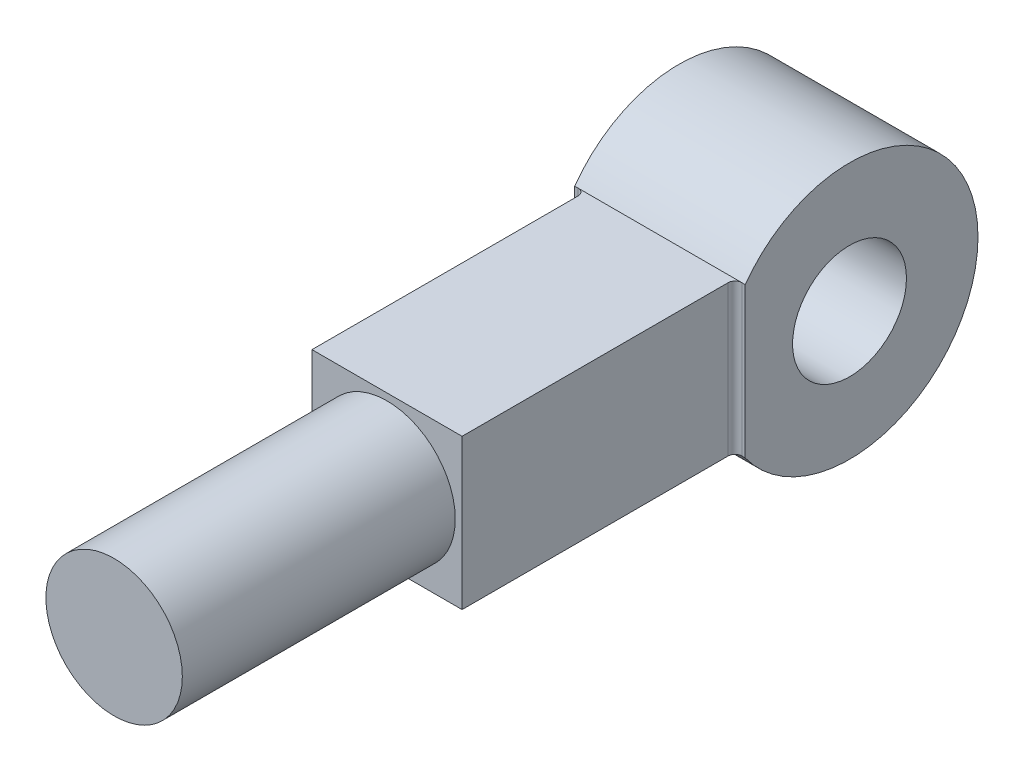
ISO-10303-21;
HEADER;
FILE_DESCRIPTION(('STEP AP214'),'2;1');
FILE_NAME('part.step','',(''),(''),'','','');
FILE_SCHEMA(('AUTOMOTIVE_DESIGN { 1 0 10303 214 1 1 1 1 }'));
ENDSEC;
DATA;
#1=APPLICATION_CONTEXT('core data for automotive mechanical design processes');
#2=APPLICATION_PROTOCOL_DEFINITION('international standard','automotive_design',2000,#1);
#3=PRODUCT_CONTEXT('',#1,'mechanical');
#4=PRODUCT('Part','Part','',(#3));
#5=PRODUCT_RELATED_PRODUCT_CATEGORY('part','',(#4));
#6=PRODUCT_DEFINITION_FORMATION('','',#4);
#7=PRODUCT_DEFINITION_CONTEXT('part definition',#1,'design');
#8=PRODUCT_DEFINITION('design','',#6,#7);
#9=PRODUCT_DEFINITION_SHAPE('','',#8);
#10=(LENGTH_UNIT() NAMED_UNIT(*) SI_UNIT(.MILLI.,.METRE.));
#11=(NAMED_UNIT(*) PLANE_ANGLE_UNIT() SI_UNIT($,.RADIAN.));
#12=(NAMED_UNIT(*) SI_UNIT($,.STERADIAN.) SOLID_ANGLE_UNIT());
#13=UNCERTAINTY_MEASURE_WITH_UNIT(LENGTH_MEASURE(1.E-05),#10,'distance_accuracy_value','');
#14=(GEOMETRIC_REPRESENTATION_CONTEXT(3) GLOBAL_UNCERTAINTY_ASSIGNED_CONTEXT((#13)) GLOBAL_UNIT_ASSIGNED_CONTEXT((#10,
#11,#12)) REPRESENTATION_CONTEXT('',''));
#15=CARTESIAN_POINT('',(0.,0.,0.));
#16=DIRECTION('',(0.,0.,1.));
#17=DIRECTION('',(1.,0.,0.));
#18=AXIS2_PLACEMENT_3D('',#15,#16,#17);
#19=CARTESIAN_POINT('',(25.,0.,0.));
#20=DIRECTION('',(1.,0.,0.));
#21=DIRECTION('',(0.,0.,-1.));
#22=AXIS2_PLACEMENT_3D('',#19,#20,#21);
#23=PLANE('',#22);
#24=DIRECTION('',(0.,-1.,0.));
#25=VECTOR('',#24,1.);
#26=CARTESIAN_POINT('',(25.,18.83,15.2829611005197));
#27=LINE('',#26,#25);
#28=CARTESIAN_POINT('',(25.,11.,15.2829611005197));
#29=VERTEX_POINT('',#28);
#30=CARTESIAN_POINT('',(25.,-11.,15.2829611005198));
#31=VERTEX_POINT('',#30);
#32=EDGE_CURVE('E179',#29,#31,#27,.T.);
#33=ORIENTED_EDGE('',*,*,#32,.T.);
#34=CARTESIAN_POINT('',(25.,0.,0.));
#35=DIRECTION('',(1.,0.,0.));
#36=DIRECTION('',(0.,0.,-1.));
#37=AXIS2_PLACEMENT_3D('',#34,#35,#36);
#38=CIRCLE('',#37,18.83);
#39=EDGE_CURVE('E148',#31,#29,#38,.T.);
#40=ORIENTED_EDGE('',*,*,#39,.T.);
#41=EDGE_LOOP('',(#33,#40));
#42=FACE_BOUND('',#41,.T.);
#43=CARTESIAN_POINT('',(25.,0.,0.));
#44=DIRECTION('',(1.,0.,0.));
#45=DIRECTION('',(0.,0.,-1.));
#46=AXIS2_PLACEMENT_3D('',#43,#44,#45);
#47=CIRCLE('',#46,8.345);
#48=CARTESIAN_POINT('',(25.,0.,-8.345));
#49=VERTEX_POINT('',#48);
#50=EDGE_CURVE('E205',#49,#49,#47,.T.);
#51=ORIENTED_EDGE('',*,*,#50,.F.);
#52=EDGE_LOOP('',(#51));
#53=FACE_BOUND('',#52,.T.);
#54=ADVANCED_FACE('F45',(#42,#53),#23,.T.);
#55=CARTESIAN_POINT('',(0.,0.,0.));
#56=DIRECTION('',(1.,0.,0.));
#57=DIRECTION('',(0.,0.,-1.));
#58=AXIS2_PLACEMENT_3D('',#55,#56,#57);
#59=PLANE('',#58);
#60=CARTESIAN_POINT('',(0.,0.,0.));
#61=DIRECTION('',(1.,0.,0.));
#62=DIRECTION('',(0.,0.,-1.));
#63=AXIS2_PLACEMENT_3D('',#60,#61,#62);
#64=CIRCLE('',#63,18.83);
#65=CARTESIAN_POINT('',(0.,-11.,15.2829611005198));
#66=VERTEX_POINT('',#65);
#67=CARTESIAN_POINT('',(0.,11.,15.2829611005197));
#68=VERTEX_POINT('',#67);
#69=EDGE_CURVE('E154',#66,#68,#64,.T.);
#70=ORIENTED_EDGE('',*,*,#69,.F.);
#71=DIRECTION('',(0.,-1.,0.));
#72=VECTOR('',#71,1.);
#73=CARTESIAN_POINT('',(0.,18.83,15.2829611005197));
#74=LINE('',#73,#72);
#75=EDGE_CURVE('E70',#68,#66,#74,.T.);
#76=ORIENTED_EDGE('',*,*,#75,.F.);
#77=EDGE_LOOP('',(#70,#76));
#78=FACE_BOUND('',#77,.T.);
#79=CARTESIAN_POINT('',(0.,0.,0.));
#80=DIRECTION('',(1.,0.,0.));
#81=DIRECTION('',(0.,0.,-1.));
#82=AXIS2_PLACEMENT_3D('',#79,#80,#81);
#83=CIRCLE('',#82,8.345);
#84=CARTESIAN_POINT('',(0.,0.,-8.345));
#85=VERTEX_POINT('',#84);
#86=EDGE_CURVE('E204',#85,#85,#83,.T.);
#87=ORIENTED_EDGE('',*,*,#86,.T.);
#88=EDGE_LOOP('',(#87));
#89=FACE_BOUND('',#88,.T.);
#90=ADVANCED_FACE('F213',(#78,#89),#59,.F.);
#91=CARTESIAN_POINT('',(25.,0.,0.));
#92=DIRECTION('',(-1.,0.,0.));
#93=DIRECTION('',(0.,0.,1.));
#94=AXIS2_PLACEMENT_3D('',#91,#92,#93);
#95=CYLINDRICAL_SURFACE('',#94,18.83);
#96=ORIENTED_EDGE('',*,*,#69,.T.);
#97=DIRECTION('',(1.,0.,0.));
#98=VECTOR('',#97,1.);
#99=CARTESIAN_POINT('',(25.,11.,15.2829611005197));
#100=LINE('',#99,#98);
#101=CARTESIAN_POINT('',(0.5,11.,15.2829611005197));
#102=VERTEX_POINT('',#101);
#103=EDGE_CURVE('E192',#68,#102,#100,.T.);
#104=ORIENTED_EDGE('',*,*,#103,.T.);
#105=DIRECTION('',(-1.,0.,0.));
#106=VECTOR('',#105,1.);
#107=CARTESIAN_POINT('',(25.,11.,15.2829611005198));
#108=LINE('',#107,#106);
#109=CARTESIAN_POINT('',(24.5,11.,15.2829611005197));
#110=VERTEX_POINT('',#109);
#111=EDGE_CURVE('E162',#110,#102,#108,.T.);
#112=ORIENTED_EDGE('',*,*,#111,.F.);
#113=EDGE_CURVE('E49',#29,#110,#108,.T.);
#114=ORIENTED_EDGE('',*,*,#113,.F.);
#115=ORIENTED_EDGE('',*,*,#39,.F.);
#116=DIRECTION('',(-1.,0.,0.));
#117=VECTOR('',#116,1.);
#118=CARTESIAN_POINT('',(25.,-11.,15.2829611005198));
#119=LINE('',#118,#117);
#120=CARTESIAN_POINT('',(24.5,-11.,15.2829611005198));
#121=VERTEX_POINT('',#120);
#122=EDGE_CURVE('E146',#31,#121,#119,.T.);
#123=ORIENTED_EDGE('',*,*,#122,.T.);
#124=CARTESIAN_POINT('',(0.5,-11.,15.2829611005198));
#125=VERTEX_POINT('',#124);
#126=EDGE_CURVE('E140',#121,#125,#119,.T.);
#127=ORIENTED_EDGE('',*,*,#126,.T.);
#128=DIRECTION('',(1.,0.,0.));
#129=VECTOR('',#128,1.);
#130=CARTESIAN_POINT('',(0.,-11.,15.2829611005198));
#131=LINE('',#130,#129);
#132=EDGE_CURVE('E126',#66,#125,#131,.T.);
#133=ORIENTED_EDGE('',*,*,#132,.F.);
#134=EDGE_LOOP('',(#96,#104,#112,#114,#115,#123,#127,#133));
#135=FACE_BOUND('',#134,.T.);
#136=ADVANCED_FACE('F47',(#135),#95,.T.);
#137=CARTESIAN_POINT('',(25.,11.,15.2829611005198));
#138=DIRECTION('',(0.,-1.,0.));
#139=DIRECTION('',(0.,0.,-1.));
#140=AXIS2_PLACEMENT_3D('',#137,#138,#139);
#141=PLANE('',#140);
#142=CARTESIAN_POINT('',(0.5,11.,16.2829611005197));
#143=DIRECTION('',(0.,-1.,0.));
#144=DIRECTION('',(0.,0.,-1.));
#145=AXIS2_PLACEMENT_3D('',#142,#143,#144);
#146=CIRCLE('',#145,0.999999999999999);
#147=CARTESIAN_POINT('',(1.5,11.,16.2829611005197));
#148=VERTEX_POINT('',#147);
#149=EDGE_CURVE('E121',#102,#148,#146,.T.);
#150=ORIENTED_EDGE('',*,*,#149,.T.);
#151=DIRECTION('',(0.,0.,1.));
#152=VECTOR('',#151,1.);
#153=CARTESIAN_POINT('',(1.5,11.,15.2829611005198));
#154=LINE('',#153,#152);
#155=CARTESIAN_POINT('',(1.5,11.,55.2829611005197));
#156=VERTEX_POINT('',#155);
#157=EDGE_CURVE('E197',#148,#156,#154,.T.);
#158=ORIENTED_EDGE('',*,*,#157,.T.);
#159=DIRECTION('',(-1.,0.,0.));
#160=VECTOR('',#159,1.);
#161=CARTESIAN_POINT('',(25.,11.,55.2829611005197));
#162=LINE('',#161,#160);
#163=CARTESIAN_POINT('',(23.5,11.,55.2829611005197));
#164=VERTEX_POINT('',#163);
#165=EDGE_CURVE('E159',#164,#156,#162,.T.);
#166=ORIENTED_EDGE('',*,*,#165,.F.);
#167=DIRECTION('',(0.,0.,-1.));
#168=VECTOR('',#167,1.);
#169=CARTESIAN_POINT('',(23.5,11.,15.2829611005198));
#170=LINE('',#169,#168);
#171=CARTESIAN_POINT('',(23.5,11.,16.2829611005197));
#172=VERTEX_POINT('',#171);
#173=EDGE_CURVE('E190',#164,#172,#170,.T.);
#174=ORIENTED_EDGE('',*,*,#173,.T.);
#175=CARTESIAN_POINT('',(24.5,11.,16.2829611005197));
#176=DIRECTION('',(0.,-1.,0.));
#177=DIRECTION('',(0.,0.,-1.));
#178=AXIS2_PLACEMENT_3D('',#175,#176,#177);
#179=CIRCLE('',#178,1.);
#180=EDGE_CURVE('E182',#172,#110,#179,.T.);
#181=ORIENTED_EDGE('',*,*,#180,.T.);
#182=ORIENTED_EDGE('',*,*,#111,.T.);
#183=EDGE_LOOP('',(#150,#158,#166,#174,#181,#182));
#184=FACE_BOUND('',#183,.T.);
#185=ADVANCED_FACE('F189',(#184),#141,.F.);
#186=CARTESIAN_POINT('',(25.,-11.,55.2829611005197));
#187=DIRECTION('',(0.,0.,-1.));
#188=DIRECTION('',(-1.,0.,0.));
#189=AXIS2_PLACEMENT_3D('',#186,#187,#188);
#190=PLANE('',#189);
#191=CARTESIAN_POINT('',(12.5,-1.21430643318376E-13,55.2829611005197));
#192=DIRECTION('',(0.,0.,1.));
#193=DIRECTION('',(1.,0.,0.));
#194=AXIS2_PLACEMENT_3D('',#191,#192,#193);
#195=CIRCLE('',#194,10.);
#196=CARTESIAN_POINT('',(22.5,-1.21430643318376E-13,55.2829611005197));
#197=VERTEX_POINT('',#196);
#198=EDGE_CURVE('E11',#197,#197,#195,.T.);
#199=ORIENTED_EDGE('',*,*,#198,.F.);
#200=EDGE_LOOP('',(#199));
#201=FACE_BOUND('',#200,.T.);
#202=ORIENTED_EDGE('',*,*,#165,.T.);
#203=DIRECTION('',(0.,-1.,0.));
#204=VECTOR('',#203,1.);
#205=CARTESIAN_POINT('',(1.5,18.83,55.2829611005197));
#206=LINE('',#205,#204);
#207=CARTESIAN_POINT('',(1.5,-11.,55.2829611005197));
#208=VERTEX_POINT('',#207);
#209=EDGE_CURVE('E366',#156,#208,#206,.T.);
#210=ORIENTED_EDGE('',*,*,#209,.T.);
#211=DIRECTION('',(-1.,0.,0.));
#212=VECTOR('',#211,1.);
#213=CARTESIAN_POINT('',(25.,-11.,55.2829611005197));
#214=LINE('',#213,#212);
#215=CARTESIAN_POINT('',(23.5,-11.,55.2829611005197));
#216=VERTEX_POINT('',#215);
#217=EDGE_CURVE('E152',#216,#208,#214,.T.);
#218=ORIENTED_EDGE('',*,*,#217,.F.);
#219=DIRECTION('',(0.,-1.,0.));
#220=VECTOR('',#219,1.);
#221=CARTESIAN_POINT('',(23.5,18.83,55.2829611005197));
#222=LINE('',#221,#220);
#223=EDGE_CURVE('E62',#164,#216,#222,.T.);
#224=ORIENTED_EDGE('',*,*,#223,.F.);
#225=EDGE_LOOP('',(#202,#210,#218,#224));
#226=FACE_BOUND('',#225,.T.);
#227=ADVANCED_FACE('F224',(#201,#226),#190,.F.);
#228=CARTESIAN_POINT('',(25.,-11.,15.2829611005198));
#229=DIRECTION('',(0.,1.,0.));
#230=DIRECTION('',(0.,0.,1.));
#231=AXIS2_PLACEMENT_3D('',#228,#229,#230);
#232=PLANE('',#231);
#233=ORIENTED_EDGE('',*,*,#217,.T.);
#234=DIRECTION('',(0.,0.,1.));
#235=VECTOR('',#234,1.);
#236=CARTESIAN_POINT('',(1.5,-11.,16.2829611005197));
#237=LINE('',#236,#235);
#238=CARTESIAN_POINT('',(1.5,-11.,16.2829611005197));
#239=VERTEX_POINT('',#238);
#240=EDGE_CURVE('E142',#239,#208,#237,.T.);
#241=ORIENTED_EDGE('',*,*,#240,.F.);
#242=CARTESIAN_POINT('',(0.5,-11.,16.2829611005197));
#243=DIRECTION('',(0.,-1.,0.));
#244=DIRECTION('',(0.,0.,1.));
#245=AXIS2_PLACEMENT_3D('',#242,#243,#244);
#246=CIRCLE('',#245,0.999999999999999);
#247=EDGE_CURVE('E118',#125,#239,#246,.T.);
#248=ORIENTED_EDGE('',*,*,#247,.F.);
#249=ORIENTED_EDGE('',*,*,#126,.F.);
#250=CARTESIAN_POINT('',(24.5,-11.,16.2829611005198));
#251=DIRECTION('',(0.,-1.,0.));
#252=DIRECTION('',(0.,0.,-1.));
#253=AXIS2_PLACEMENT_3D('',#250,#251,#252);
#254=CIRCLE('',#253,1.);
#255=CARTESIAN_POINT('',(23.5,-11.,16.2829611005198));
#256=VERTEX_POINT('',#255);
#257=EDGE_CURVE('E184',#256,#121,#254,.T.);
#258=ORIENTED_EDGE('',*,*,#257,.F.);
#259=DIRECTION('',(0.,0.,-1.));
#260=VECTOR('',#259,1.);
#261=CARTESIAN_POINT('',(23.5,-11.,55.2829611005197));
#262=LINE('',#261,#260);
#263=EDGE_CURVE('E133',#216,#256,#262,.T.);
#264=ORIENTED_EDGE('',*,*,#263,.F.);
#265=EDGE_LOOP('',(#233,#241,#248,#249,#258,#264));
#266=FACE_BOUND('',#265,.T.);
#267=ADVANCED_FACE('F138',(#266),#232,.F.);
#268=CARTESIAN_POINT('',(25.,0.,0.));
#269=DIRECTION('',(-1.,0.,0.));
#270=DIRECTION('',(0.,0.,1.));
#271=AXIS2_PLACEMENT_3D('',#268,#269,#270);
#272=CYLINDRICAL_SURFACE('',#271,8.345);
#273=ORIENTED_EDGE('',*,*,#50,.T.);
#274=EDGE_LOOP('',(#273));
#275=FACE_BOUND('',#274,.T.);
#276=ORIENTED_EDGE('',*,*,#86,.F.);
#277=EDGE_LOOP('',(#276));
#278=FACE_BOUND('',#277,.T.);
#279=ADVANCED_FACE('F215',(#275,#278),#272,.F.);
#280=CARTESIAN_POINT('',(24.5,18.83,15.2829611005197));
#281=DIRECTION('',(0.,0.,-1.));
#282=DIRECTION('',(0.,1.,0.));
#283=AXIS2_PLACEMENT_3D('',#280,#281,#282);
#284=PLANE('',#283);
#285=DIRECTION('',(0.,-1.,0.));
#286=VECTOR('',#285,1.);
#287=CARTESIAN_POINT('',(24.5,18.83,15.2829611005197));
#288=LINE('',#287,#286);
#289=EDGE_CURVE('E176',#110,#121,#288,.T.);
#290=ORIENTED_EDGE('',*,*,#289,.T.);
#291=ORIENTED_EDGE('',*,*,#122,.F.);
#292=ORIENTED_EDGE('',*,*,#32,.F.);
#293=ORIENTED_EDGE('',*,*,#113,.T.);
#294=EDGE_LOOP('',(#290,#291,#292,#293));
#295=FACE_BOUND('',#294,.T.);
#296=ADVANCED_FACE('F175',(#295),#284,.F.);
#297=CARTESIAN_POINT('',(24.5,18.83,16.2829611005197));
#298=DIRECTION('',(0.,-1.,0.));
#299=DIRECTION('',(0.,0.,-1.));
#300=AXIS2_PLACEMENT_3D('',#297,#298,#299);
#301=CYLINDRICAL_SURFACE('',#300,1.);
#302=DIRECTION('',(0.,-1.,0.));
#303=VECTOR('',#302,1.);
#304=CARTESIAN_POINT('',(23.5,18.83,16.2829611005197));
#305=LINE('',#304,#303);
#306=EDGE_CURVE('E186',#172,#256,#305,.T.);
#307=ORIENTED_EDGE('',*,*,#306,.T.);
#308=ORIENTED_EDGE('',*,*,#257,.T.);
#309=ORIENTED_EDGE('',*,*,#289,.F.);
#310=ORIENTED_EDGE('',*,*,#180,.F.);
#311=EDGE_LOOP('',(#307,#308,#309,#310));
#312=FACE_BOUND('',#311,.T.);
#313=ADVANCED_FACE('F181',(#312),#301,.F.);
#314=CARTESIAN_POINT('',(23.5,18.83,55.2829611005197));
#315=DIRECTION('',(-1.,0.,0.));
#316=DIRECTION('',(0.,0.,1.));
#317=AXIS2_PLACEMENT_3D('',#314,#315,#316);
#318=PLANE('',#317);
#319=ORIENTED_EDGE('',*,*,#223,.T.);
#320=ORIENTED_EDGE('',*,*,#263,.T.);
#321=ORIENTED_EDGE('',*,*,#306,.F.);
#322=ORIENTED_EDGE('',*,*,#173,.F.);
#323=EDGE_LOOP('',(#319,#320,#321,#322));
#324=FACE_BOUND('',#323,.T.);
#325=ADVANCED_FACE('F284',(#324),#318,.F.);
#326=CARTESIAN_POINT('',(1.5,18.83,16.2829611005197));
#327=DIRECTION('',(1.,0.,0.));
#328=DIRECTION('',(0.,0.,-1.));
#329=AXIS2_PLACEMENT_3D('',#326,#327,#328);
#330=PLANE('',#329);
#331=DIRECTION('',(0.,-1.,0.));
#332=VECTOR('',#331,1.);
#333=CARTESIAN_POINT('',(1.5,18.83,16.2829611005197));
#334=LINE('',#333,#332);
#335=EDGE_CURVE('E124',#148,#239,#334,.T.);
#336=ORIENTED_EDGE('',*,*,#335,.T.);
#337=ORIENTED_EDGE('',*,*,#240,.T.);
#338=ORIENTED_EDGE('',*,*,#209,.F.);
#339=ORIENTED_EDGE('',*,*,#157,.F.);
#340=EDGE_LOOP('',(#336,#337,#338,#339));
#341=FACE_BOUND('',#340,.T.);
#342=ADVANCED_FACE('F294',(#341),#330,.F.);
#343=CARTESIAN_POINT('',(0.5,18.83,16.2829611005197));
#344=DIRECTION('',(0.,-1.,0.));
#345=DIRECTION('',(0.,0.,-1.));
#346=AXIS2_PLACEMENT_3D('',#343,#344,#345);
#347=CYLINDRICAL_SURFACE('',#346,0.999999999999999);
#348=DIRECTION('',(0.,-1.,0.));
#349=VECTOR('',#348,1.);
#350=CARTESIAN_POINT('',(0.5,18.83,15.2829611005197));
#351=LINE('',#350,#349);
#352=EDGE_CURVE('E114',#102,#125,#351,.T.);
#353=ORIENTED_EDGE('',*,*,#352,.T.);
#354=ORIENTED_EDGE('',*,*,#247,.T.);
#355=ORIENTED_EDGE('',*,*,#335,.F.);
#356=ORIENTED_EDGE('',*,*,#149,.F.);
#357=EDGE_LOOP('',(#353,#354,#355,#356));
#358=FACE_BOUND('',#357,.T.);
#359=ADVANCED_FACE('F115',(#358),#347,.F.);
#360=CARTESIAN_POINT('',(0.,18.83,15.2829611005197));
#361=DIRECTION('',(0.,0.,-1.));
#362=DIRECTION('',(-1.,0.,0.));
#363=AXIS2_PLACEMENT_3D('',#360,#361,#362);
#364=PLANE('',#363);
#365=ORIENTED_EDGE('',*,*,#75,.T.);
#366=ORIENTED_EDGE('',*,*,#132,.T.);
#367=ORIENTED_EDGE('',*,*,#352,.F.);
#368=ORIENTED_EDGE('',*,*,#103,.F.);
#369=EDGE_LOOP('',(#365,#366,#367,#368));
#370=FACE_BOUND('',#369,.T.);
#371=ADVANCED_FACE('F127',(#370),#364,.F.);
#372=CARTESIAN_POINT('',(12.5,-1.21430643318376E-13,95.2829611005198));
#373=DIRECTION('',(0.,0.,-1.));
#374=DIRECTION('',(-1.,0.,0.));
#375=AXIS2_PLACEMENT_3D('',#372,#373,#374);
#376=CYLINDRICAL_SURFACE('',#375,10.);
#377=CARTESIAN_POINT('',(12.5,-1.21430643318376E-13,95.2829611005198));
#378=DIRECTION('',(0.,0.,1.));
#379=DIRECTION('',(1.,0.,0.));
#380=AXIS2_PLACEMENT_3D('',#377,#378,#379);
#381=CIRCLE('',#380,10.);
#382=CARTESIAN_POINT('',(22.5,-1.21430643318376E-13,95.2829611005198));
#383=VERTEX_POINT('',#382);
#384=EDGE_CURVE('E358',#383,#383,#381,.T.);
#385=ORIENTED_EDGE('',*,*,#384,.F.);
#386=EDGE_LOOP('',(#385));
#387=FACE_BOUND('',#386,.T.);
#388=ORIENTED_EDGE('',*,*,#198,.T.);
#389=EDGE_LOOP('',(#388));
#390=FACE_BOUND('',#389,.T.);
#391=ADVANCED_FACE('F323',(#387,#390),#376,.T.);
#392=CARTESIAN_POINT('',(12.5,-1.21430643318376E-13,95.2829611005198));
#393=DIRECTION('',(0.,0.,1.));
#394=DIRECTION('',(1.,0.,0.));
#395=AXIS2_PLACEMENT_3D('',#392,#393,#394);
#396=PLANE('',#395);
#397=ORIENTED_EDGE('',*,*,#384,.T.);
#398=EDGE_LOOP('',(#397));
#399=FACE_BOUND('',#398,.T.);
#400=ADVANCED_FACE('F334',(#399),#396,.T.);
#401=CLOSED_SHELL('',(#54,#90,#136,#185,#227,#267,#279,#296,#313,#325,#342,#359,#371,#391,#400));
#402=MANIFOLD_SOLID_BREP('B2',#401);
#403=ADVANCED_BREP_SHAPE_REPRESENTATION('',(#18,#402),#14);
#404=SHAPE_DEFINITION_REPRESENTATION(#9,#403);
ENDSEC;
END-ISO-10303-21;
